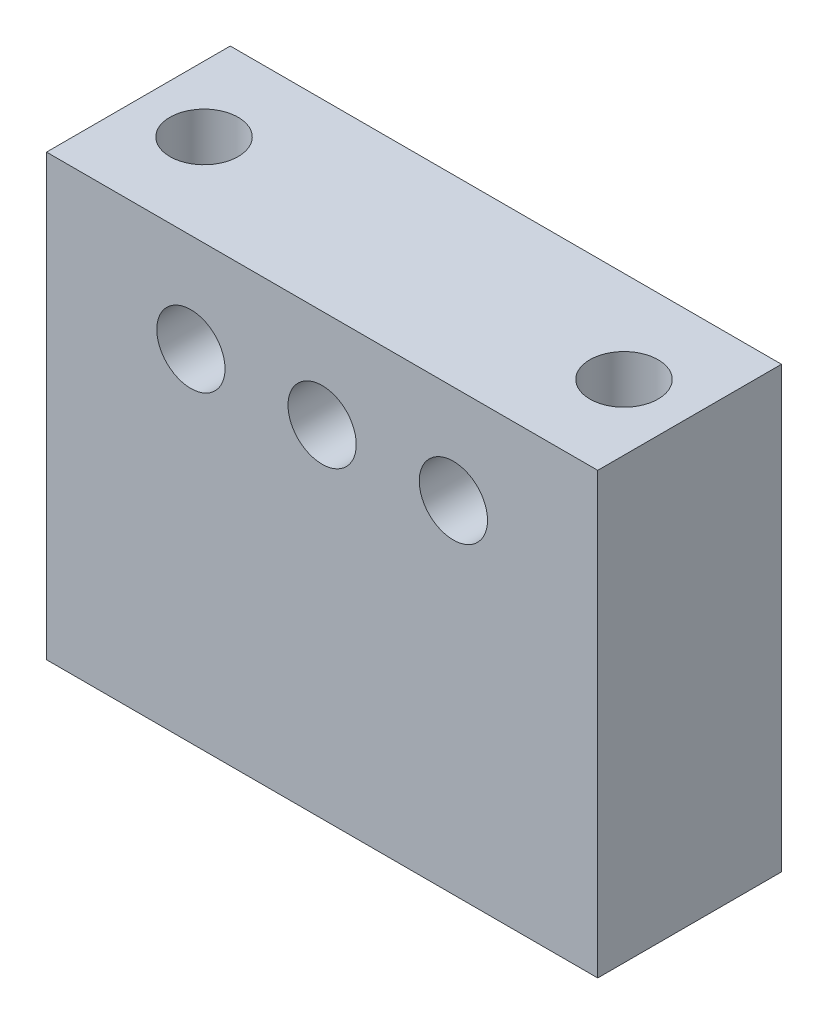
ISO-10303-21;
HEADER;
FILE_DESCRIPTION(('STEP AP214'),'2;1');
FILE_NAME('part.step','',(''),(''),'','','');
FILE_SCHEMA(('AUTOMOTIVE_DESIGN { 1 0 10303 214 1 1 1 1 }'));
ENDSEC;
DATA;
#1=APPLICATION_CONTEXT('core data for automotive mechanical design processes');
#2=APPLICATION_PROTOCOL_DEFINITION('international standard','automotive_design',2000,#1);
#3=PRODUCT_CONTEXT('',#1,'mechanical');
#4=PRODUCT('Part','Part','',(#3));
#5=PRODUCT_RELATED_PRODUCT_CATEGORY('part','',(#4));
#6=PRODUCT_DEFINITION_FORMATION('','',#4);
#7=PRODUCT_DEFINITION_CONTEXT('part definition',#1,'design');
#8=PRODUCT_DEFINITION('design','',#6,#7);
#9=PRODUCT_DEFINITION_SHAPE('','',#8);
#10=(LENGTH_UNIT() NAMED_UNIT(*) SI_UNIT(.MILLI.,.METRE.));
#11=(NAMED_UNIT(*) PLANE_ANGLE_UNIT() SI_UNIT($,.RADIAN.));
#12=(NAMED_UNIT(*) SI_UNIT($,.STERADIAN.) SOLID_ANGLE_UNIT());
#13=UNCERTAINTY_MEASURE_WITH_UNIT(LENGTH_MEASURE(1.E-05),#10,'distance_accuracy_value','');
#14=(GEOMETRIC_REPRESENTATION_CONTEXT(3) GLOBAL_UNCERTAINTY_ASSIGNED_CONTEXT((#13)) GLOBAL_UNIT_ASSIGNED_CONTEXT((#10,
#11,#12)) REPRESENTATION_CONTEXT('',''));
#15=CARTESIAN_POINT('',(0.,0.,0.));
#16=DIRECTION('',(0.,0.,1.));
#17=DIRECTION('',(1.,0.,0.));
#18=AXIS2_PLACEMENT_3D('',#15,#16,#17);
#19=CARTESIAN_POINT('',(21.,33.5,7.));
#20=DIRECTION('',(-1.,0.,0.));
#21=DIRECTION('',(0.,0.,1.));
#22=AXIS2_PLACEMENT_3D('',#19,#20,#21);
#23=PLANE('',#22);
#24=DIRECTION('',(0.,0.,-1.));
#25=VECTOR('',#24,1.);
#26=CARTESIAN_POINT('',(21.,0.,7.));
#27=LINE('',#26,#25);
#28=CARTESIAN_POINT('',(21.,0.,7.));
#29=VERTEX_POINT('',#28);
#30=CARTESIAN_POINT('',(21.,0.,-7.));
#31=VERTEX_POINT('',#30);
#32=EDGE_CURVE('E96',#29,#31,#27,.T.);
#33=ORIENTED_EDGE('',*,*,#32,.T.);
#34=DIRECTION('',(0.,-1.,0.));
#35=VECTOR('',#34,1.);
#36=CARTESIAN_POINT('',(21.,33.5,-7.));
#37=LINE('',#36,#35);
#38=CARTESIAN_POINT('',(21.,33.5,-7.));
#39=VERTEX_POINT('',#38);
#40=EDGE_CURVE('E11',#39,#31,#37,.T.);
#41=ORIENTED_EDGE('',*,*,#40,.F.);
#42=DIRECTION('',(0.,0.,-1.));
#43=VECTOR('',#42,1.);
#44=CARTESIAN_POINT('',(21.,33.5,7.));
#45=LINE('',#44,#43);
#46=CARTESIAN_POINT('',(21.,33.5,7.));
#47=VERTEX_POINT('',#46);
#48=EDGE_CURVE('E84',#47,#39,#45,.T.);
#49=ORIENTED_EDGE('',*,*,#48,.F.);
#50=DIRECTION('',(0.,-1.,0.));
#51=VECTOR('',#50,1.);
#52=CARTESIAN_POINT('',(21.,33.5,7.));
#53=LINE('',#52,#51);
#54=EDGE_CURVE('E92',#47,#29,#53,.T.);
#55=ORIENTED_EDGE('',*,*,#54,.T.);
#56=EDGE_LOOP('',(#33,#41,#49,#55));
#57=FACE_BOUND('',#56,.T.);
#58=ADVANCED_FACE('F33',(#57),#23,.F.);
#59=CARTESIAN_POINT('',(-21.,33.5,-7.));
#60=DIRECTION('',(0.,0.,1.));
#61=DIRECTION('',(1.,0.,0.));
#62=AXIS2_PLACEMENT_3D('',#59,#60,#61);
#63=PLANE('',#62);
#64=CARTESIAN_POINT('',(-10.,26.,-7.));
#65=DIRECTION('',(0.,0.,1.));
#66=DIRECTION('',(1.,0.,0.));
#67=AXIS2_PLACEMENT_3D('',#64,#65,#66);
#68=CIRCLE('',#67,2.6);
#69=CARTESIAN_POINT('',(-7.4,26.,-7.));
#70=VERTEX_POINT('',#69);
#71=EDGE_CURVE('E131',#70,#70,#68,.T.);
#72=ORIENTED_EDGE('',*,*,#71,.T.);
#73=EDGE_LOOP('',(#72));
#74=FACE_BOUND('',#73,.T.);
#75=CARTESIAN_POINT('',(10.,26.,-7.));
#76=DIRECTION('',(0.,0.,1.));
#77=DIRECTION('',(1.,0.,0.));
#78=AXIS2_PLACEMENT_3D('',#75,#76,#77);
#79=CIRCLE('',#78,2.6);
#80=CARTESIAN_POINT('',(12.6,26.,-7.));
#81=VERTEX_POINT('',#80);
#82=EDGE_CURVE('E125',#81,#81,#79,.T.);
#83=ORIENTED_EDGE('',*,*,#82,.T.);
#84=EDGE_LOOP('',(#83));
#85=FACE_BOUND('',#84,.T.);
#86=CARTESIAN_POINT('',(0.,26.,-7.));
#87=DIRECTION('',(0.,0.,1.));
#88=DIRECTION('',(1.,0.,0.));
#89=AXIS2_PLACEMENT_3D('',#86,#87,#88);
#90=CIRCLE('',#89,2.6);
#91=CARTESIAN_POINT('',(2.6,26.,-7.));
#92=VERTEX_POINT('',#91);
#93=EDGE_CURVE('E119',#92,#92,#90,.T.);
#94=ORIENTED_EDGE('',*,*,#93,.T.);
#95=EDGE_LOOP('',(#94));
#96=FACE_BOUND('',#95,.T.);
#97=DIRECTION('',(-1.,0.,0.));
#98=VECTOR('',#97,1.);
#99=CARTESIAN_POINT('',(-21.,0.,-7.));
#100=LINE('',#99,#98);
#101=CARTESIAN_POINT('',(-21.,0.,-7.));
#102=VERTEX_POINT('',#101);
#103=EDGE_CURVE('E88',#31,#102,#100,.T.);
#104=ORIENTED_EDGE('',*,*,#103,.T.);
#105=DIRECTION('',(0.,-1.,0.));
#106=VECTOR('',#105,1.);
#107=CARTESIAN_POINT('',(-21.,33.5,-7.));
#108=LINE('',#107,#106);
#109=CARTESIAN_POINT('',(-21.,33.5,-7.));
#110=VERTEX_POINT('',#109);
#111=EDGE_CURVE('E41',#110,#102,#108,.T.);
#112=ORIENTED_EDGE('',*,*,#111,.F.);
#113=DIRECTION('',(-1.,0.,0.));
#114=VECTOR('',#113,1.);
#115=CARTESIAN_POINT('',(-21.,33.5,-7.));
#116=LINE('',#115,#114);
#117=EDGE_CURVE('E79',#39,#110,#116,.T.);
#118=ORIENTED_EDGE('',*,*,#117,.F.);
#119=ORIENTED_EDGE('',*,*,#40,.T.);
#120=EDGE_LOOP('',(#104,#112,#118,#119));
#121=FACE_BOUND('',#120,.T.);
#122=ADVANCED_FACE('F87',(#74,#85,#96,#121),#63,.F.);
#123=CARTESIAN_POINT('',(-21.,33.5,7.));
#124=DIRECTION('',(1.,0.,0.));
#125=DIRECTION('',(0.,0.,-1.));
#126=AXIS2_PLACEMENT_3D('',#123,#124,#125);
#127=PLANE('',#126);
#128=DIRECTION('',(0.,0.,1.));
#129=VECTOR('',#128,1.);
#130=CARTESIAN_POINT('',(-21.,0.,7.));
#131=LINE('',#130,#129);
#132=CARTESIAN_POINT('',(-21.,0.,7.));
#133=VERTEX_POINT('',#132);
#134=EDGE_CURVE('E66',#102,#133,#131,.T.);
#135=ORIENTED_EDGE('',*,*,#134,.T.);
#136=DIRECTION('',(0.,-1.,0.));
#137=VECTOR('',#136,1.);
#138=CARTESIAN_POINT('',(-21.,33.5,7.));
#139=LINE('',#138,#137);
#140=CARTESIAN_POINT('',(-21.,33.5,7.));
#141=VERTEX_POINT('',#140);
#142=EDGE_CURVE('E89',#141,#133,#139,.T.);
#143=ORIENTED_EDGE('',*,*,#142,.F.);
#144=DIRECTION('',(0.,0.,1.));
#145=VECTOR('',#144,1.);
#146=CARTESIAN_POINT('',(-21.,33.5,7.));
#147=LINE('',#146,#145);
#148=EDGE_CURVE('E82',#110,#141,#147,.T.);
#149=ORIENTED_EDGE('',*,*,#148,.F.);
#150=ORIENTED_EDGE('',*,*,#111,.T.);
#151=EDGE_LOOP('',(#135,#143,#149,#150));
#152=FACE_BOUND('',#151,.T.);
#153=ADVANCED_FACE('F90',(#152),#127,.F.);
#154=CARTESIAN_POINT('',(-21.,33.5,7.));
#155=DIRECTION('',(0.,0.,-1.));
#156=DIRECTION('',(-1.,0.,0.));
#157=AXIS2_PLACEMENT_3D('',#154,#155,#156);
#158=PLANE('',#157);
#159=CARTESIAN_POINT('',(-10.,26.,7.));
#160=DIRECTION('',(0.,0.,1.));
#161=DIRECTION('',(1.,0.,0.));
#162=AXIS2_PLACEMENT_3D('',#159,#160,#161);
#163=CIRCLE('',#162,2.6);
#164=CARTESIAN_POINT('',(-7.4,26.,7.));
#165=VERTEX_POINT('',#164);
#166=EDGE_CURVE('E134',#165,#165,#163,.T.);
#167=ORIENTED_EDGE('',*,*,#166,.F.);
#168=EDGE_LOOP('',(#167));
#169=FACE_BOUND('',#168,.T.);
#170=CARTESIAN_POINT('',(10.,26.,7.));
#171=DIRECTION('',(0.,0.,1.));
#172=DIRECTION('',(1.,0.,0.));
#173=AXIS2_PLACEMENT_3D('',#170,#171,#172);
#174=CIRCLE('',#173,2.6);
#175=CARTESIAN_POINT('',(12.6,26.,7.));
#176=VERTEX_POINT('',#175);
#177=EDGE_CURVE('E128',#176,#176,#174,.T.);
#178=ORIENTED_EDGE('',*,*,#177,.F.);
#179=EDGE_LOOP('',(#178));
#180=FACE_BOUND('',#179,.T.);
#181=CARTESIAN_POINT('',(0.,26.,7.));
#182=DIRECTION('',(0.,0.,1.));
#183=DIRECTION('',(1.,0.,0.));
#184=AXIS2_PLACEMENT_3D('',#181,#182,#183);
#185=CIRCLE('',#184,2.6);
#186=CARTESIAN_POINT('',(2.6,26.,7.));
#187=VERTEX_POINT('',#186);
#188=EDGE_CURVE('E122',#187,#187,#185,.T.);
#189=ORIENTED_EDGE('',*,*,#188,.F.);
#190=EDGE_LOOP('',(#189));
#191=FACE_BOUND('',#190,.T.);
#192=DIRECTION('',(1.,0.,0.));
#193=VECTOR('',#192,1.);
#194=CARTESIAN_POINT('',(-21.,0.,7.));
#195=LINE('',#194,#193);
#196=EDGE_CURVE('E72',#133,#29,#195,.T.);
#197=ORIENTED_EDGE('',*,*,#196,.T.);
#198=ORIENTED_EDGE('',*,*,#54,.F.);
#199=DIRECTION('',(1.,0.,0.));
#200=VECTOR('',#199,1.);
#201=CARTESIAN_POINT('',(-21.,33.5,7.));
#202=LINE('',#201,#200);
#203=EDGE_CURVE('E49',#141,#47,#202,.T.);
#204=ORIENTED_EDGE('',*,*,#203,.F.);
#205=ORIENTED_EDGE('',*,*,#142,.T.);
#206=EDGE_LOOP('',(#197,#198,#204,#205));
#207=FACE_BOUND('',#206,.T.);
#208=ADVANCED_FACE('F104',(#169,#180,#191,#207),#158,.F.);
#209=CARTESIAN_POINT('',(0.,33.5,0.));
#210=DIRECTION('',(0.,-1.,0.));
#211=DIRECTION('',(0.,0.,-1.));
#212=AXIS2_PLACEMENT_3D('',#209,#210,#211);
#213=PLANE('',#212);
#214=CARTESIAN_POINT('',(16.,33.5,0.));
#215=DIRECTION('',(0.,1.,0.));
#216=DIRECTION('',(0.,0.,1.));
#217=AXIS2_PLACEMENT_3D('',#214,#215,#216);
#218=CIRCLE('',#217,2.6);
#219=CARTESIAN_POINT('',(16.,33.5,2.6));
#220=VERTEX_POINT('',#219);
#221=EDGE_CURVE('E116',#220,#220,#218,.T.);
#222=ORIENTED_EDGE('',*,*,#221,.F.);
#223=EDGE_LOOP('',(#222));
#224=FACE_BOUND('',#223,.T.);
#225=CARTESIAN_POINT('',(-16.,33.5,0.));
#226=DIRECTION('',(0.,1.,0.));
#227=DIRECTION('',(0.,0.,1.));
#228=AXIS2_PLACEMENT_3D('',#225,#226,#227);
#229=CIRCLE('',#228,2.6);
#230=CARTESIAN_POINT('',(-16.,33.5,2.6));
#231=VERTEX_POINT('',#230);
#232=EDGE_CURVE('E110',#231,#231,#229,.T.);
#233=ORIENTED_EDGE('',*,*,#232,.F.);
#234=EDGE_LOOP('',(#233));
#235=FACE_BOUND('',#234,.T.);
#236=ORIENTED_EDGE('',*,*,#48,.T.);
#237=ORIENTED_EDGE('',*,*,#117,.T.);
#238=ORIENTED_EDGE('',*,*,#148,.T.);
#239=ORIENTED_EDGE('',*,*,#203,.T.);
#240=EDGE_LOOP('',(#236,#237,#238,#239));
#241=FACE_BOUND('',#240,.T.);
#242=ADVANCED_FACE('F80',(#224,#235,#241),#213,.F.);
#243=CARTESIAN_POINT('',(0.,0.,0.));
#244=DIRECTION('',(0.,-1.,0.));
#245=DIRECTION('',(0.,0.,-1.));
#246=AXIS2_PLACEMENT_3D('',#243,#244,#245);
#247=PLANE('',#246);
#248=CARTESIAN_POINT('',(16.,0.,0.));
#249=DIRECTION('',(0.,1.,0.));
#250=DIRECTION('',(0.,0.,1.));
#251=AXIS2_PLACEMENT_3D('',#248,#249,#250);
#252=CIRCLE('',#251,2.6);
#253=CARTESIAN_POINT('',(16.,0.,2.6));
#254=VERTEX_POINT('',#253);
#255=EDGE_CURVE('E113',#254,#254,#252,.T.);
#256=ORIENTED_EDGE('',*,*,#255,.T.);
#257=EDGE_LOOP('',(#256));
#258=FACE_BOUND('',#257,.T.);
#259=CARTESIAN_POINT('',(-16.,0.,0.));
#260=DIRECTION('',(0.,1.,0.));
#261=DIRECTION('',(0.,0.,1.));
#262=AXIS2_PLACEMENT_3D('',#259,#260,#261);
#263=CIRCLE('',#262,2.6);
#264=CARTESIAN_POINT('',(-16.,0.,2.6));
#265=VERTEX_POINT('',#264);
#266=EDGE_CURVE('E99',#265,#265,#263,.T.);
#267=ORIENTED_EDGE('',*,*,#266,.T.);
#268=EDGE_LOOP('',(#267));
#269=FACE_BOUND('',#268,.T.);
#270=ORIENTED_EDGE('',*,*,#32,.F.);
#271=ORIENTED_EDGE('',*,*,#196,.F.);
#272=ORIENTED_EDGE('',*,*,#134,.F.);
#273=ORIENTED_EDGE('',*,*,#103,.F.);
#274=EDGE_LOOP('',(#270,#271,#272,#273));
#275=FACE_BOUND('',#274,.T.);
#276=ADVANCED_FACE('F107',(#258,#269,#275),#247,.T.);
#277=CARTESIAN_POINT('',(-16.,0.,0.));
#278=DIRECTION('',(0.,1.,0.));
#279=DIRECTION('',(0.,0.,1.));
#280=AXIS2_PLACEMENT_3D('',#277,#278,#279);
#281=CYLINDRICAL_SURFACE('',#280,2.6);
#282=ORIENTED_EDGE('',*,*,#266,.F.);
#283=EDGE_LOOP('',(#282));
#284=FACE_BOUND('',#283,.T.);
#285=ORIENTED_EDGE('',*,*,#232,.T.);
#286=EDGE_LOOP('',(#285));
#287=FACE_BOUND('',#286,.T.);
#288=ADVANCED_FACE('F167',(#284,#287),#281,.F.);
#289=CARTESIAN_POINT('',(16.,0.,0.));
#290=DIRECTION('',(0.,1.,0.));
#291=DIRECTION('',(0.,0.,1.));
#292=AXIS2_PLACEMENT_3D('',#289,#290,#291);
#293=CYLINDRICAL_SURFACE('',#292,2.6);
#294=ORIENTED_EDGE('',*,*,#255,.F.);
#295=EDGE_LOOP('',(#294));
#296=FACE_BOUND('',#295,.T.);
#297=ORIENTED_EDGE('',*,*,#221,.T.);
#298=EDGE_LOOP('',(#297));
#299=FACE_BOUND('',#298,.T.);
#300=ADVANCED_FACE('F158',(#296,#299),#293,.F.);
#301=CARTESIAN_POINT('',(0.,26.,-7.));
#302=DIRECTION('',(0.,0.,1.));
#303=DIRECTION('',(1.,0.,0.));
#304=AXIS2_PLACEMENT_3D('',#301,#302,#303);
#305=CYLINDRICAL_SURFACE('',#304,2.6);
#306=ORIENTED_EDGE('',*,*,#93,.F.);
#307=EDGE_LOOP('',(#306));
#308=FACE_BOUND('',#307,.T.);
#309=ORIENTED_EDGE('',*,*,#188,.T.);
#310=EDGE_LOOP('',(#309));
#311=FACE_BOUND('',#310,.T.);
#312=ADVANCED_FACE('F156',(#308,#311),#305,.F.);
#313=CARTESIAN_POINT('',(10.,26.,-7.));
#314=DIRECTION('',(0.,0.,1.));
#315=DIRECTION('',(1.,0.,0.));
#316=AXIS2_PLACEMENT_3D('',#313,#314,#315);
#317=CYLINDRICAL_SURFACE('',#316,2.6);
#318=ORIENTED_EDGE('',*,*,#82,.F.);
#319=EDGE_LOOP('',(#318));
#320=FACE_BOUND('',#319,.T.);
#321=ORIENTED_EDGE('',*,*,#177,.T.);
#322=EDGE_LOOP('',(#321));
#323=FACE_BOUND('',#322,.T.);
#324=ADVANCED_FACE('F145',(#320,#323),#317,.F.);
#325=CARTESIAN_POINT('',(-10.,26.,-7.));
#326=DIRECTION('',(0.,0.,1.));
#327=DIRECTION('',(1.,0.,0.));
#328=AXIS2_PLACEMENT_3D('',#325,#326,#327);
#329=CYLINDRICAL_SURFACE('',#328,2.6);
#330=ORIENTED_EDGE('',*,*,#71,.F.);
#331=EDGE_LOOP('',(#330));
#332=FACE_BOUND('',#331,.T.);
#333=ORIENTED_EDGE('',*,*,#166,.T.);
#334=EDGE_LOOP('',(#333));
#335=FACE_BOUND('',#334,.T.);
#336=ADVANCED_FACE('F142',(#332,#335),#329,.F.);
#337=CLOSED_SHELL('',(#58,#122,#153,#208,#242,#276,#288,#300,#312,#324,#336));
#338=MANIFOLD_SOLID_BREP('B2',#337);
#339=ADVANCED_BREP_SHAPE_REPRESENTATION('',(#18,#338),#14);
#340=SHAPE_DEFINITION_REPRESENTATION(#9,#339);
ENDSEC;
END-ISO-10303-21;
